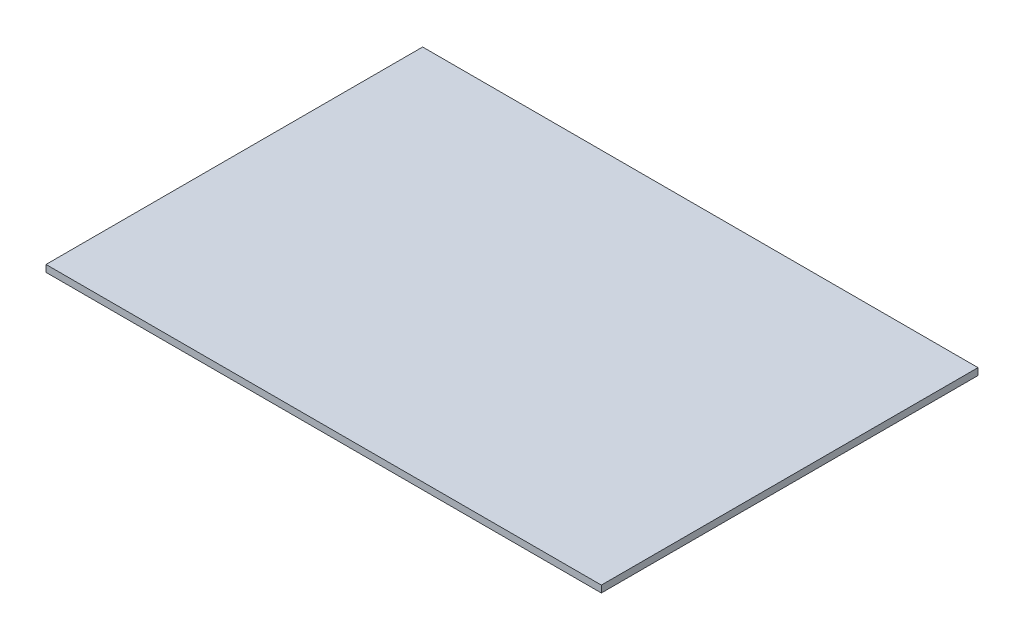
ISO-10303-21;
HEADER;
FILE_DESCRIPTION(('STEP AP214'),'2;1');
FILE_NAME('part.step','',(''),(''),'','','');
FILE_SCHEMA(('AUTOMOTIVE_DESIGN { 1 0 10303 214 1 1 1 1 }'));
ENDSEC;
DATA;
#1=APPLICATION_CONTEXT('core data for automotive mechanical design processes');
#2=APPLICATION_PROTOCOL_DEFINITION('international standard','automotive_design',2000,#1);
#3=PRODUCT_CONTEXT('',#1,'mechanical');
#4=PRODUCT('Part','Part','',(#3));
#5=PRODUCT_RELATED_PRODUCT_CATEGORY('part','',(#4));
#6=PRODUCT_DEFINITION_FORMATION('','',#4);
#7=PRODUCT_DEFINITION_CONTEXT('part definition',#1,'design');
#8=PRODUCT_DEFINITION('design','',#6,#7);
#9=PRODUCT_DEFINITION_SHAPE('','',#8);
#10=(LENGTH_UNIT() NAMED_UNIT(*) SI_UNIT(.MILLI.,.METRE.));
#11=(NAMED_UNIT(*) PLANE_ANGLE_UNIT() SI_UNIT($,.RADIAN.));
#12=(NAMED_UNIT(*) SI_UNIT($,.STERADIAN.) SOLID_ANGLE_UNIT());
#13=UNCERTAINTY_MEASURE_WITH_UNIT(LENGTH_MEASURE(1.E-05),#10,'distance_accuracy_value','');
#14=(GEOMETRIC_REPRESENTATION_CONTEXT(3) GLOBAL_UNCERTAINTY_ASSIGNED_CONTEXT((#13)) GLOBAL_UNIT_ASSIGNED_CONTEXT((#10,
#11,#12)) REPRESENTATION_CONTEXT('',''));
#15=CARTESIAN_POINT('',(0.,0.,0.));
#16=DIRECTION('',(0.,0.,1.));
#17=DIRECTION('',(1.,0.,0.));
#18=AXIS2_PLACEMENT_3D('',#15,#16,#17);
#19=CARTESIAN_POINT('',(102.580798220228,2.54,69.5721255256004));
#20=DIRECTION('',(-1.,0.,0.));
#21=DIRECTION('',(0.,0.,1.));
#22=AXIS2_PLACEMENT_3D('',#19,#20,#21);
#23=PLANE('',#22);
#24=DIRECTION('',(0.,0.,-1.));
#25=VECTOR('',#24,1.);
#26=CARTESIAN_POINT('',(102.580798220228,0.,69.5721255256004));
#27=LINE('',#26,#25);
#28=CARTESIAN_POINT('',(102.580798220228,0.,69.5721255256004));
#29=VERTEX_POINT('',#28);
#30=CARTESIAN_POINT('',(102.580798220228,0.,-69.5721255256004));
#31=VERTEX_POINT('',#30);
#32=EDGE_CURVE('E95',#29,#31,#27,.T.);
#33=ORIENTED_EDGE('',*,*,#32,.T.);
#34=DIRECTION('',(0.,-1.,0.));
#35=VECTOR('',#34,1.);
#36=CARTESIAN_POINT('',(102.580798220228,2.54,-69.5721255256004));
#37=LINE('',#36,#35);
#38=CARTESIAN_POINT('',(102.580798220228,2.54,-69.5721255256004));
#39=VERTEX_POINT('',#38);
#40=EDGE_CURVE('E11',#39,#31,#37,.T.);
#41=ORIENTED_EDGE('',*,*,#40,.F.);
#42=DIRECTION('',(0.,0.,-1.));
#43=VECTOR('',#42,1.);
#44=CARTESIAN_POINT('',(102.580798220228,2.54,69.5721255256004));
#45=LINE('',#44,#43);
#46=CARTESIAN_POINT('',(102.580798220228,2.54,69.5721255256004));
#47=VERTEX_POINT('',#46);
#48=EDGE_CURVE('E83',#47,#39,#45,.T.);
#49=ORIENTED_EDGE('',*,*,#48,.F.);
#50=DIRECTION('',(0.,-1.,0.));
#51=VECTOR('',#50,1.);
#52=CARTESIAN_POINT('',(102.580798220228,2.54,69.5721255256004));
#53=LINE('',#52,#51);
#54=EDGE_CURVE('E91',#47,#29,#53,.T.);
#55=ORIENTED_EDGE('',*,*,#54,.T.);
#56=EDGE_LOOP('',(#33,#41,#49,#55));
#57=FACE_BOUND('',#56,.T.);
#58=ADVANCED_FACE('F32',(#57),#23,.F.);
#59=CARTESIAN_POINT('',(-102.580798220228,2.54,-69.5721255256004));
#60=DIRECTION('',(0.,0.,1.));
#61=DIRECTION('',(1.,0.,0.));
#62=AXIS2_PLACEMENT_3D('',#59,#60,#61);
#63=PLANE('',#62);
#64=DIRECTION('',(-1.,0.,0.));
#65=VECTOR('',#64,1.);
#66=CARTESIAN_POINT('',(-102.580798220228,0.,-69.5721255256004));
#67=LINE('',#66,#65);
#68=CARTESIAN_POINT('',(-102.580798220228,0.,-69.5721255256004));
#69=VERTEX_POINT('',#68);
#70=EDGE_CURVE('E87',#31,#69,#67,.T.);
#71=ORIENTED_EDGE('',*,*,#70,.T.);
#72=DIRECTION('',(0.,-1.,0.));
#73=VECTOR('',#72,1.);
#74=CARTESIAN_POINT('',(-102.580798220228,2.54,-69.5721255256004));
#75=LINE('',#74,#73);
#76=CARTESIAN_POINT('',(-102.580798220228,2.54,-69.5721255256004));
#77=VERTEX_POINT('',#76);
#78=EDGE_CURVE('E40',#77,#69,#75,.T.);
#79=ORIENTED_EDGE('',*,*,#78,.F.);
#80=DIRECTION('',(-1.,0.,0.));
#81=VECTOR('',#80,1.);
#82=CARTESIAN_POINT('',(-102.580798220228,2.54,-69.5721255256004));
#83=LINE('',#82,#81);
#84=EDGE_CURVE('E78',#39,#77,#83,.T.);
#85=ORIENTED_EDGE('',*,*,#84,.F.);
#86=ORIENTED_EDGE('',*,*,#40,.T.);
#87=EDGE_LOOP('',(#71,#79,#85,#86));
#88=FACE_BOUND('',#87,.T.);
#89=ADVANCED_FACE('F86',(#88),#63,.F.);
#90=CARTESIAN_POINT('',(-102.580798220228,2.54,69.5721255256004));
#91=DIRECTION('',(1.,0.,0.));
#92=DIRECTION('',(0.,0.,-1.));
#93=AXIS2_PLACEMENT_3D('',#90,#91,#92);
#94=PLANE('',#93);
#95=DIRECTION('',(0.,0.,1.));
#96=VECTOR('',#95,1.);
#97=CARTESIAN_POINT('',(-102.580798220228,0.,69.5721255256004));
#98=LINE('',#97,#96);
#99=CARTESIAN_POINT('',(-102.580798220228,0.,69.5721255256004));
#100=VERTEX_POINT('',#99);
#101=EDGE_CURVE('E65',#69,#100,#98,.T.);
#102=ORIENTED_EDGE('',*,*,#101,.T.);
#103=DIRECTION('',(0.,-1.,0.));
#104=VECTOR('',#103,1.);
#105=CARTESIAN_POINT('',(-102.580798220228,2.54,69.5721255256004));
#106=LINE('',#105,#104);
#107=CARTESIAN_POINT('',(-102.580798220228,2.54,69.5721255256004));
#108=VERTEX_POINT('',#107);
#109=EDGE_CURVE('E88',#108,#100,#106,.T.);
#110=ORIENTED_EDGE('',*,*,#109,.F.);
#111=DIRECTION('',(0.,0.,1.));
#112=VECTOR('',#111,1.);
#113=CARTESIAN_POINT('',(-102.580798220228,2.54,69.5721255256004));
#114=LINE('',#113,#112);
#115=EDGE_CURVE('E81',#77,#108,#114,.T.);
#116=ORIENTED_EDGE('',*,*,#115,.F.);
#117=ORIENTED_EDGE('',*,*,#78,.T.);
#118=EDGE_LOOP('',(#102,#110,#116,#117));
#119=FACE_BOUND('',#118,.T.);
#120=ADVANCED_FACE('F89',(#119),#94,.F.);
#121=CARTESIAN_POINT('',(-102.580798220228,2.54,69.5721255256004));
#122=DIRECTION('',(0.,0.,-1.));
#123=DIRECTION('',(-1.,0.,0.));
#124=AXIS2_PLACEMENT_3D('',#121,#122,#123);
#125=PLANE('',#124);
#126=DIRECTION('',(1.,0.,0.));
#127=VECTOR('',#126,1.);
#128=CARTESIAN_POINT('',(-102.580798220228,0.,69.5721255256004));
#129=LINE('',#128,#127);
#130=EDGE_CURVE('E71',#100,#29,#129,.T.);
#131=ORIENTED_EDGE('',*,*,#130,.T.);
#132=ORIENTED_EDGE('',*,*,#54,.F.);
#133=DIRECTION('',(1.,0.,0.));
#134=VECTOR('',#133,1.);
#135=CARTESIAN_POINT('',(-102.580798220228,2.54,69.5721255256004));
#136=LINE('',#135,#134);
#137=EDGE_CURVE('E48',#108,#47,#136,.T.);
#138=ORIENTED_EDGE('',*,*,#137,.F.);
#139=ORIENTED_EDGE('',*,*,#109,.T.);
#140=EDGE_LOOP('',(#131,#132,#138,#139));
#141=FACE_BOUND('',#140,.T.);
#142=ADVANCED_FACE('F102',(#141),#125,.F.);
#143=CARTESIAN_POINT('',(0.,2.54,0.));
#144=DIRECTION('',(0.,-1.,0.));
#145=DIRECTION('',(0.,0.,-1.));
#146=AXIS2_PLACEMENT_3D('',#143,#144,#145);
#147=PLANE('',#146);
#148=ORIENTED_EDGE('',*,*,#48,.T.);
#149=ORIENTED_EDGE('',*,*,#84,.T.);
#150=ORIENTED_EDGE('',*,*,#115,.T.);
#151=ORIENTED_EDGE('',*,*,#137,.T.);
#152=EDGE_LOOP('',(#148,#149,#150,#151));
#153=FACE_BOUND('',#152,.T.);
#154=ADVANCED_FACE('F79',(#153),#147,.F.);
#155=CARTESIAN_POINT('',(0.,0.,0.));
#156=DIRECTION('',(0.,-1.,0.));
#157=DIRECTION('',(0.,0.,-1.));
#158=AXIS2_PLACEMENT_3D('',#155,#156,#157);
#159=PLANE('',#158);
#160=ORIENTED_EDGE('',*,*,#32,.F.);
#161=ORIENTED_EDGE('',*,*,#130,.F.);
#162=ORIENTED_EDGE('',*,*,#101,.F.);
#163=ORIENTED_EDGE('',*,*,#70,.F.);
#164=EDGE_LOOP('',(#160,#161,#162,#163));
#165=FACE_BOUND('',#164,.T.);
#166=ADVANCED_FACE('F105',(#165),#159,.T.);
#167=CLOSED_SHELL('',(#58,#89,#120,#142,#154,#166));
#168=MANIFOLD_SOLID_BREP('B2',#167);
#169=ADVANCED_BREP_SHAPE_REPRESENTATION('',(#18,#168),#14);
#170=SHAPE_DEFINITION_REPRESENTATION(#9,#169);
ENDSEC;
END-ISO-10303-21;
